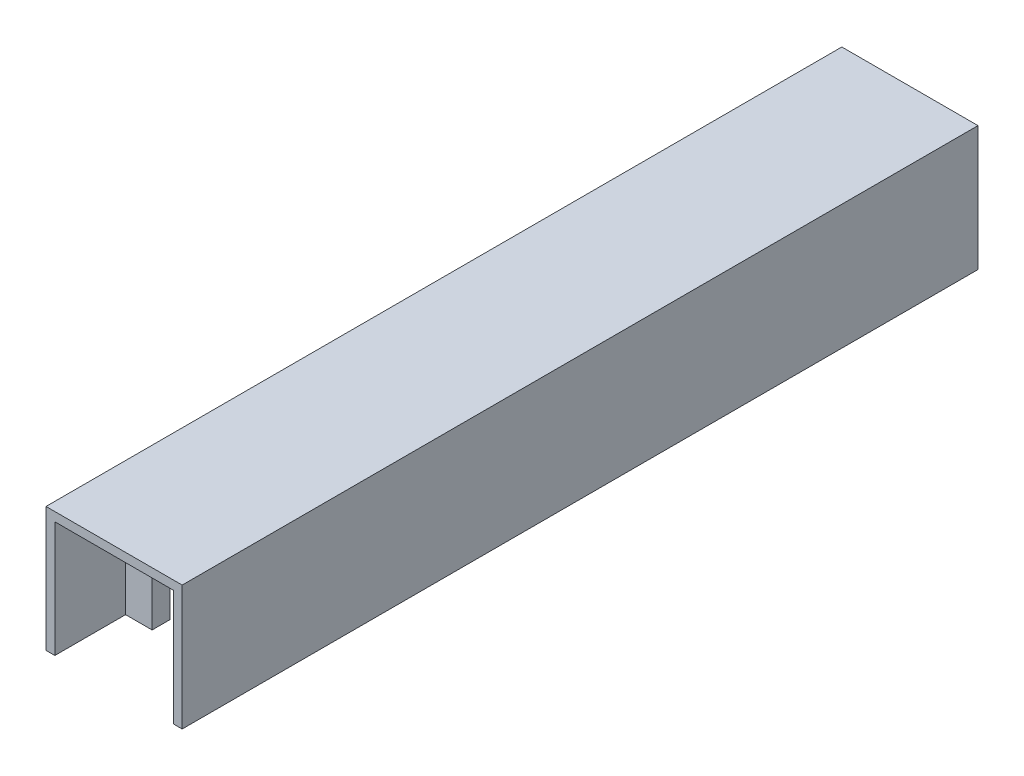
ISO-10303-21;
HEADER;
FILE_DESCRIPTION(('STEP AP214'),'2;1');
FILE_NAME('part.step','',(''),(''),'','','');
FILE_SCHEMA(('AUTOMOTIVE_DESIGN { 1 0 10303 214 1 1 1 1 }'));
ENDSEC;
DATA;
#1=APPLICATION_CONTEXT('core data for automotive mechanical design processes');
#2=APPLICATION_PROTOCOL_DEFINITION('international standard','automotive_design',2000,#1);
#3=PRODUCT_CONTEXT('',#1,'mechanical');
#4=PRODUCT('Part','Part','',(#3));
#5=PRODUCT_RELATED_PRODUCT_CATEGORY('part','',(#4));
#6=PRODUCT_DEFINITION_FORMATION('','',#4);
#7=PRODUCT_DEFINITION_CONTEXT('part definition',#1,'design');
#8=PRODUCT_DEFINITION('design','',#6,#7);
#9=PRODUCT_DEFINITION_SHAPE('','',#8);
#10=(LENGTH_UNIT() NAMED_UNIT(*) SI_UNIT(.MILLI.,.METRE.));
#11=(NAMED_UNIT(*) PLANE_ANGLE_UNIT() SI_UNIT($,.RADIAN.));
#12=(NAMED_UNIT(*) SI_UNIT($,.STERADIAN.) SOLID_ANGLE_UNIT());
#13=UNCERTAINTY_MEASURE_WITH_UNIT(LENGTH_MEASURE(1.E-05),#10,'distance_accuracy_value','');
#14=(GEOMETRIC_REPRESENTATION_CONTEXT(3) GLOBAL_UNCERTAINTY_ASSIGNED_CONTEXT((#13)) GLOBAL_UNIT_ASSIGNED_CONTEXT((#10,
#11,#12)) REPRESENTATION_CONTEXT('',''));
#15=CARTESIAN_POINT('',(0.,0.,0.));
#16=DIRECTION('',(0.,0.,1.));
#17=DIRECTION('',(1.,0.,0.));
#18=AXIS2_PLACEMENT_3D('',#15,#16,#17);
#19=CARTESIAN_POINT('',(-38.5,-35.,0.));
#20=DIRECTION('',(0.,-1.,0.));
#21=DIRECTION('',(0.,0.,-1.));
#22=AXIS2_PLACEMENT_3D('',#19,#20,#21);
#23=PLANE('',#22);
#24=DIRECTION('',(1.,0.,0.));
#25=VECTOR('',#24,1.);
#26=CARTESIAN_POINT('',(-26.,-35.,-50.));
#27=LINE('',#26,#25);
#28=CARTESIAN_POINT('',(-33.5,-35.,-50.));
#29=VERTEX_POINT('',#28);
#30=CARTESIAN_POINT('',(-18.5,-35.,-50.));
#31=VERTEX_POINT('',#30);
#32=EDGE_CURVE('E506',#29,#31,#27,.T.);
#33=ORIENTED_EDGE('',*,*,#32,.F.);
#34=DIRECTION('',(0.,0.,1.));
#35=VECTOR('',#34,1.);
#36=CARTESIAN_POINT('',(-33.5,-35.,25.));
#37=LINE('',#36,#35);
#38=CARTESIAN_POINT('',(-33.5,-35.,100.));
#39=VERTEX_POINT('',#38);
#40=EDGE_CURVE('E417',#29,#39,#37,.T.);
#41=ORIENTED_EDGE('',*,*,#40,.T.);
#42=DIRECTION('',(1.,0.,0.));
#43=VECTOR('',#42,1.);
#44=CARTESIAN_POINT('',(-26.,-35.,100.));
#45=LINE('',#44,#43);
#46=CARTESIAN_POINT('',(-18.5,-35.,100.));
#47=VERTEX_POINT('',#46);
#48=EDGE_CURVE('E490',#39,#47,#45,.T.);
#49=ORIENTED_EDGE('',*,*,#48,.T.);
#50=CARTESIAN_POINT('',(-18.5,-35.,110.));
#51=CARTESIAN_POINT('',(-18.5,-35.,100.));
#52=(BOUNDED_CURVE() B_SPLINE_CURVE(1,(#50,#51),.UNSPECIFIED.,.F.,
.F.) B_SPLINE_CURVE_WITH_KNOTS((2,2),(0.,10.),
.UNSPECIFIED.) CURVE() GEOMETRIC_REPRESENTATION_ITEM() RATIONAL_B_SPLINE_CURVE((1.,1.)) REPRESENTATION_ITEM(''));
#53=CARTESIAN_POINT('',(-18.5,-35.,110.));
#54=VERTEX_POINT('',#53);
#55=EDGE_CURVE('E371',#54,#47,#52,.T.);
#56=ORIENTED_EDGE('',*,*,#55,.F.);
#57=DIRECTION('',(1.,0.,0.));
#58=VECTOR('',#57,1.);
#59=CARTESIAN_POINT('',(-26.,-35.,110.));
#60=LINE('',#59,#58);
#61=CARTESIAN_POINT('',(-33.5,-35.,110.));
#62=VERTEX_POINT('',#61);
#63=EDGE_CURVE('E491',#62,#54,#60,.T.);
#64=ORIENTED_EDGE('',*,*,#63,.F.);
#65=DIRECTION('',(0.,0.,1.));
#66=VECTOR('',#65,1.);
#67=CARTESIAN_POINT('',(-33.5,-35.,130.));
#68=LINE('',#67,#66);
#69=CARTESIAN_POINT('',(-33.5,-35.,150.));
#70=VERTEX_POINT('',#69);
#71=EDGE_CURVE('E44',#62,#70,#68,.T.);
#72=ORIENTED_EDGE('',*,*,#71,.T.);
#73=DIRECTION('',(-1.,0.,0.));
#74=VECTOR('',#73,1.);
#75=CARTESIAN_POINT('',(-36.,-35.,150.));
#76=LINE('',#75,#74);
#77=CARTESIAN_POINT('',(-38.5,-35.,150.));
#78=VERTEX_POINT('',#77);
#79=EDGE_CURVE('E466',#70,#78,#76,.T.);
#80=ORIENTED_EDGE('',*,*,#79,.T.);
#81=DIRECTION('',(0.,0.,1.));
#82=VECTOR('',#81,1.);
#83=CARTESIAN_POINT('',(-38.5,-35.,-75.));
#84=LINE('',#83,#82);
#85=CARTESIAN_POINT('',(-38.5,-35.,-300.));
#86=VERTEX_POINT('',#85);
#87=EDGE_CURVE('E11',#86,#78,#84,.T.);
#88=ORIENTED_EDGE('',*,*,#87,.F.);
#89=DIRECTION('',(-1.,0.,0.));
#90=VECTOR('',#89,1.);
#91=CARTESIAN_POINT('',(-36.,-35.,-300.));
#92=LINE('',#91,#90);
#93=CARTESIAN_POINT('',(-33.5,-35.,-300.));
#94=VERTEX_POINT('',#93);
#95=EDGE_CURVE('E361',#94,#86,#92,.T.);
#96=ORIENTED_EDGE('',*,*,#95,.F.);
#97=DIRECTION('',(0.,0.,1.));
#98=VECTOR('',#97,1.);
#99=CARTESIAN_POINT('',(-33.5,-35.,-260.));
#100=LINE('',#99,#98);
#101=CARTESIAN_POINT('',(-33.5,-35.,-220.));
#102=VERTEX_POINT('',#101);
#103=EDGE_CURVE('E252',#94,#102,#100,.T.);
#104=ORIENTED_EDGE('',*,*,#103,.T.);
#105=DIRECTION('',(1.,0.,0.));
#106=VECTOR('',#105,1.);
#107=CARTESIAN_POINT('',(-26.,-35.,-220.));
#108=LINE('',#107,#106);
#109=CARTESIAN_POINT('',(-18.5,-35.,-220.));
#110=VERTEX_POINT('',#109);
#111=EDGE_CURVE('E373',#102,#110,#108,.T.);
#112=ORIENTED_EDGE('',*,*,#111,.T.);
#113=CARTESIAN_POINT('',(-18.5,-35.,-210.));
#114=CARTESIAN_POINT('',(-18.5,-35.,-220.));
#115=(BOUNDED_CURVE() B_SPLINE_CURVE(1,(#113,#114),.UNSPECIFIED.,.F.,
.F.) B_SPLINE_CURVE_WITH_KNOTS((2,2),(0.,10.),
.UNSPECIFIED.) CURVE() GEOMETRIC_REPRESENTATION_ITEM() RATIONAL_B_SPLINE_CURVE((1.,1.)) REPRESENTATION_ITEM(''));
#116=CARTESIAN_POINT('',(-18.5,-35.,-210.));
#117=VERTEX_POINT('',#116);
#118=EDGE_CURVE('E238',#117,#110,#115,.T.);
#119=ORIENTED_EDGE('',*,*,#118,.F.);
#120=DIRECTION('',(1.,0.,0.));
#121=VECTOR('',#120,1.);
#122=CARTESIAN_POINT('',(-26.,-35.,-210.));
#123=LINE('',#122,#121);
#124=CARTESIAN_POINT('',(-33.5,-35.,-210.));
#125=VERTEX_POINT('',#124);
#126=EDGE_CURVE('E518',#125,#117,#123,.T.);
#127=ORIENTED_EDGE('',*,*,#126,.F.);
#128=DIRECTION('',(0.,0.,1.));
#129=VECTOR('',#128,1.);
#130=CARTESIAN_POINT('',(-33.5,-35.,-135.));
#131=LINE('',#130,#129);
#132=CARTESIAN_POINT('',(-33.5,-35.,-60.));
#133=VERTEX_POINT('',#132);
#134=EDGE_CURVE('E420',#125,#133,#131,.T.);
#135=ORIENTED_EDGE('',*,*,#134,.T.);
#136=DIRECTION('',(1.,0.,0.));
#137=VECTOR('',#136,1.);
#138=CARTESIAN_POINT('',(-26.,-35.,-60.));
#139=LINE('',#138,#137);
#140=CARTESIAN_POINT('',(-18.5,-35.,-60.));
#141=VERTEX_POINT('',#140);
#142=EDGE_CURVE('E505',#133,#141,#139,.T.);
#143=ORIENTED_EDGE('',*,*,#142,.T.);
#144=CARTESIAN_POINT('',(-18.5,-35.,-50.));
#145=CARTESIAN_POINT('',(-18.5,-35.,-60.));
#146=(BOUNDED_CURVE() B_SPLINE_CURVE(1,(#144,#145),.UNSPECIFIED.,.F.,
.F.) B_SPLINE_CURVE_WITH_KNOTS((2,2),(0.,10.),
.UNSPECIFIED.) CURVE() GEOMETRIC_REPRESENTATION_ITEM() RATIONAL_B_SPLINE_CURVE((1.,1.)) REPRESENTATION_ITEM(''));
#147=EDGE_CURVE('E377',#31,#141,#146,.T.);
#148=ORIENTED_EDGE('',*,*,#147,.F.);
#149=EDGE_LOOP('',(#33,#41,#49,#56,#64,#72,#80,#88,#96,#104,#112,#119,#127,#135,#143,#148));
#150=FACE_BOUND('',#149,.T.);
#151=ADVANCED_FACE('F17',(#150),#23,.T.);
#152=CARTESIAN_POINT('',(-38.5,-35.,0.));
#153=DIRECTION('',(1.,0.,0.));
#154=DIRECTION('',(0.,1.,0.));
#155=AXIS2_PLACEMENT_3D('',#152,#153,#154);
#156=PLANE('',#155);
#157=DIRECTION('',(0.,1.,0.));
#158=VECTOR('',#157,1.);
#159=CARTESIAN_POINT('',(-38.5,0.25,150.));
#160=LINE('',#159,#158);
#161=CARTESIAN_POINT('',(-38.5,35.5,150.));
#162=VERTEX_POINT('',#161);
#163=EDGE_CURVE('E463',#78,#162,#160,.T.);
#164=ORIENTED_EDGE('',*,*,#163,.T.);
#165=DIRECTION('',(0.,0.,1.));
#166=VECTOR('',#165,1.);
#167=CARTESIAN_POINT('',(-38.5,35.5,-75.));
#168=LINE('',#167,#166);
#169=CARTESIAN_POINT('',(-38.5,35.5,-300.));
#170=VERTEX_POINT('',#169);
#171=EDGE_CURVE('E30',#170,#162,#168,.T.);
#172=ORIENTED_EDGE('',*,*,#171,.F.);
#173=DIRECTION('',(0.,1.,0.));
#174=VECTOR('',#173,1.);
#175=CARTESIAN_POINT('',(-38.5,0.25,-300.));
#176=LINE('',#175,#174);
#177=EDGE_CURVE('E365',#86,#170,#176,.T.);
#178=ORIENTED_EDGE('',*,*,#177,.F.);
#179=ORIENTED_EDGE('',*,*,#87,.T.);
#180=EDGE_LOOP('',(#164,#172,#178,#179));
#181=FACE_BOUND('',#180,.T.);
#182=ADVANCED_FACE('F748',(#181),#156,.F.);
#183=CARTESIAN_POINT('',(-38.5,35.5,0.));
#184=DIRECTION('',(0.,-1.,0.));
#185=DIRECTION('',(0.,0.,-1.));
#186=AXIS2_PLACEMENT_3D('',#183,#184,#185);
#187=PLANE('',#186);
#188=DIRECTION('',(1.,0.,0.));
#189=VECTOR('',#188,1.);
#190=CARTESIAN_POINT('',(0.,35.5,150.));
#191=LINE('',#190,#189);
#192=CARTESIAN_POINT('',(38.5,35.5,150.));
#193=VERTEX_POINT('',#192);
#194=EDGE_CURVE('E467',#162,#193,#191,.T.);
#195=ORIENTED_EDGE('',*,*,#194,.T.);
#196=DIRECTION('',(0.,0.,1.));
#197=VECTOR('',#196,1.);
#198=CARTESIAN_POINT('',(38.5,35.5,-75.));
#199=LINE('',#198,#197);
#200=CARTESIAN_POINT('',(38.5,35.5,-300.));
#201=VERTEX_POINT('',#200);
#202=EDGE_CURVE('E484',#201,#193,#199,.T.);
#203=ORIENTED_EDGE('',*,*,#202,.F.);
#204=DIRECTION('',(1.,0.,0.));
#205=VECTOR('',#204,1.);
#206=CARTESIAN_POINT('',(0.,35.5,-300.));
#207=LINE('',#206,#205);
#208=EDGE_CURVE('E546',#170,#201,#207,.T.);
#209=ORIENTED_EDGE('',*,*,#208,.F.);
#210=ORIENTED_EDGE('',*,*,#171,.T.);
#211=EDGE_LOOP('',(#195,#203,#209,#210));
#212=FACE_BOUND('',#211,.T.);
#213=ADVANCED_FACE('F712',(#212),#187,.F.);
#214=CARTESIAN_POINT('',(38.5,-35.,0.));
#215=DIRECTION('',(1.,0.,0.));
#216=DIRECTION('',(0.,1.,0.));
#217=AXIS2_PLACEMENT_3D('',#214,#215,#216);
#218=PLANE('',#217);
#219=DIRECTION('',(0.,-1.,0.));
#220=VECTOR('',#219,1.);
#221=CARTESIAN_POINT('',(38.5,0.25,150.));
#222=LINE('',#221,#220);
#223=CARTESIAN_POINT('',(38.5,-35.,150.));
#224=VERTEX_POINT('',#223);
#225=EDGE_CURVE('E400',#193,#224,#222,.T.);
#226=ORIENTED_EDGE('',*,*,#225,.T.);
#227=DIRECTION('',(0.,0.,1.));
#228=VECTOR('',#227,1.);
#229=CARTESIAN_POINT('',(38.5,-35.,-75.));
#230=LINE('',#229,#228);
#231=CARTESIAN_POINT('',(38.5,-35.,-300.));
#232=VERTEX_POINT('',#231);
#233=EDGE_CURVE('E354',#232,#224,#230,.T.);
#234=ORIENTED_EDGE('',*,*,#233,.F.);
#235=DIRECTION('',(0.,-1.,0.));
#236=VECTOR('',#235,1.);
#237=CARTESIAN_POINT('',(38.5,0.25,-300.));
#238=LINE('',#237,#236);
#239=EDGE_CURVE('E543',#201,#232,#238,.T.);
#240=ORIENTED_EDGE('',*,*,#239,.F.);
#241=ORIENTED_EDGE('',*,*,#202,.T.);
#242=EDGE_LOOP('',(#226,#234,#240,#241));
#243=FACE_BOUND('',#242,.T.);
#244=ADVANCED_FACE('F706',(#243),#218,.T.);
#245=CARTESIAN_POINT('',(-33.5,30.5,0.));
#246=DIRECTION('',(-1.,0.,0.));
#247=DIRECTION('',(0.,0.,1.));
#248=AXIS2_PLACEMENT_3D('',#245,#246,#247);
#249=PLANE('',#248);
#250=DIRECTION('',(0.,-1.,0.));
#251=VECTOR('',#250,1.);
#252=CARTESIAN_POINT('',(-33.5,-2.25,110.));
#253=LINE('',#252,#251);
#254=CARTESIAN_POINT('',(-33.5,30.5,110.));
#255=VERTEX_POINT('',#254);
#256=EDGE_CURVE('E535',#255,#62,#253,.T.);
#257=ORIENTED_EDGE('',*,*,#256,.F.);
#258=DIRECTION('',(0.,0.,1.));
#259=VECTOR('',#258,1.);
#260=CARTESIAN_POINT('',(-33.5,30.5,130.));
#261=LINE('',#260,#259);
#262=CARTESIAN_POINT('',(-33.5,30.5,150.));
#263=VERTEX_POINT('',#262);
#264=EDGE_CURVE('E406',#255,#263,#261,.T.);
#265=ORIENTED_EDGE('',*,*,#264,.T.);
#266=DIRECTION('',(0.,-1.,0.));
#267=VECTOR('',#266,1.);
#268=CARTESIAN_POINT('',(-33.5,-2.25,150.));
#269=LINE('',#268,#267);
#270=EDGE_CURVE('E485',#263,#70,#269,.T.);
#271=ORIENTED_EDGE('',*,*,#270,.T.);
#272=ORIENTED_EDGE('',*,*,#71,.F.);
#273=EDGE_LOOP('',(#257,#265,#271,#272));
#274=FACE_BOUND('',#273,.T.);
#275=ADVANCED_FACE('F711',(#274),#249,.F.);
#276=CARTESIAN_POINT('',(0.,0.,150.));
#277=DIRECTION('',(0.,0.,1.));
#278=DIRECTION('',(1.,0.,0.));
#279=AXIS2_PLACEMENT_3D('',#276,#277,#278);
#280=PLANE('',#279);
#281=DIRECTION('',(-1.,0.,0.));
#282=VECTOR('',#281,1.);
#283=CARTESIAN_POINT('',(0.,30.5,150.));
#284=LINE('',#283,#282);
#285=CARTESIAN_POINT('',(33.5,30.5,150.));
#286=VERTEX_POINT('',#285);
#287=EDGE_CURVE('E413',#286,#263,#284,.T.);
#288=ORIENTED_EDGE('',*,*,#287,.F.);
#289=DIRECTION('',(0.,1.,0.));
#290=VECTOR('',#289,1.);
#291=CARTESIAN_POINT('',(33.5,-2.25,150.));
#292=LINE('',#291,#290);
#293=CARTESIAN_POINT('',(33.5,-35.,150.));
#294=VERTEX_POINT('',#293);
#295=EDGE_CURVE('E397',#294,#286,#292,.T.);
#296=ORIENTED_EDGE('',*,*,#295,.F.);
#297=DIRECTION('',(-1.,0.,0.));
#298=VECTOR('',#297,1.);
#299=CARTESIAN_POINT('',(36.,-35.,150.));
#300=LINE('',#299,#298);
#301=EDGE_CURVE('E426',#224,#294,#300,.T.);
#302=ORIENTED_EDGE('',*,*,#301,.F.);
#303=ORIENTED_EDGE('',*,*,#225,.F.);
#304=ORIENTED_EDGE('',*,*,#194,.F.);
#305=ORIENTED_EDGE('',*,*,#163,.F.);
#306=ORIENTED_EDGE('',*,*,#79,.F.);
#307=ORIENTED_EDGE('',*,*,#270,.F.);
#308=EDGE_LOOP('',(#288,#296,#302,#303,#304,#305,#306,#307));
#309=FACE_BOUND('',#308,.T.);
#310=ADVANCED_FACE('F924',(#309),#280,.T.);
#311=CARTESIAN_POINT('',(33.5,-35.,0.));
#312=DIRECTION('',(1.,0.,0.));
#313=DIRECTION('',(0.,1.,0.));
#314=AXIS2_PLACEMENT_3D('',#311,#312,#313);
#315=PLANE('',#314);
#316=DIRECTION('',(0.,1.,0.));
#317=VECTOR('',#316,1.);
#318=CARTESIAN_POINT('',(33.5,-2.25,110.));
#319=LINE('',#318,#317);
#320=CARTESIAN_POINT('',(33.5,-35.,110.));
#321=VERTEX_POINT('',#320);
#322=CARTESIAN_POINT('',(33.5,30.5,110.));
#323=VERTEX_POINT('',#322);
#324=EDGE_CURVE('E401',#321,#323,#319,.T.);
#325=ORIENTED_EDGE('',*,*,#324,.F.);
#326=DIRECTION('',(0.,0.,1.));
#327=VECTOR('',#326,1.);
#328=CARTESIAN_POINT('',(33.5,-35.,130.));
#329=LINE('',#328,#327);
#330=EDGE_CURVE('E421',#321,#294,#329,.T.);
#331=ORIENTED_EDGE('',*,*,#330,.T.);
#332=ORIENTED_EDGE('',*,*,#295,.T.);
#333=DIRECTION('',(0.,0.,1.));
#334=VECTOR('',#333,1.);
#335=CARTESIAN_POINT('',(33.5,30.5,130.));
#336=LINE('',#335,#334);
#337=EDGE_CURVE('E451',#323,#286,#336,.T.);
#338=ORIENTED_EDGE('',*,*,#337,.F.);
#339=EDGE_LOOP('',(#325,#331,#332,#338));
#340=FACE_BOUND('',#339,.T.);
#341=ADVANCED_FACE('F799',(#340),#315,.F.);
#342=CARTESIAN_POINT('',(33.5,-35.,110.));
#343=DIRECTION('',(0.,0.,1.));
#344=DIRECTION('',(1.,0.,0.));
#345=AXIS2_PLACEMENT_3D('',#342,#343,#344);
#346=PLANE('',#345);
#347=DIRECTION('',(-1.,0.,0.));
#348=VECTOR('',#347,1.);
#349=CARTESIAN_POINT('',(26.,-35.,110.));
#350=LINE('',#349,#348);
#351=CARTESIAN_POINT('',(18.5,-35.,110.));
#352=VERTEX_POINT('',#351);
#353=EDGE_CURVE('E425',#321,#352,#350,.T.);
#354=ORIENTED_EDGE('',*,*,#353,.F.);
#355=ORIENTED_EDGE('',*,*,#324,.T.);
#356=DIRECTION('',(-1.,0.,0.));
#357=VECTOR('',#356,1.);
#358=CARTESIAN_POINT('',(26.,30.5,110.));
#359=LINE('',#358,#357);
#360=CARTESIAN_POINT('',(18.5,30.5,110.));
#361=VERTEX_POINT('',#360);
#362=EDGE_CURVE('E556',#323,#361,#359,.T.);
#363=ORIENTED_EDGE('',*,*,#362,.T.);
#364=DIRECTION('',(0.,1.,0.));
#365=VECTOR('',#364,1.);
#366=CARTESIAN_POINT('',(18.5,-2.25,110.));
#367=LINE('',#366,#365);
#368=EDGE_CURVE('E395',#352,#361,#367,.T.);
#369=ORIENTED_EDGE('',*,*,#368,.F.);
#370=EDGE_LOOP('',(#354,#355,#363,#369));
#371=FACE_BOUND('',#370,.T.);
#372=ADVANCED_FACE('F793',(#371),#346,.T.);
#373=CARTESIAN_POINT('',(18.5,0.,0.));
#374=DIRECTION('',(-1.,0.,0.));
#375=DIRECTION('',(0.,0.,1.));
#376=AXIS2_PLACEMENT_3D('',#373,#374,#375);
#377=PLANE('',#376);
#378=DIRECTION('',(0.,0.,1.));
#379=VECTOR('',#378,1.);
#380=CARTESIAN_POINT('',(18.5,-35.,105.));
#381=LINE('',#380,#379);
#382=CARTESIAN_POINT('',(18.5,-35.,100.));
#383=VERTEX_POINT('',#382);
#384=EDGE_CURVE('E457',#383,#352,#381,.T.);
#385=ORIENTED_EDGE('',*,*,#384,.T.);
#386=ORIENTED_EDGE('',*,*,#368,.T.);
#387=DIRECTION('',(0.,0.,-1.));
#388=VECTOR('',#387,1.);
#389=CARTESIAN_POINT('',(18.5,30.5,105.));
#390=LINE('',#389,#388);
#391=CARTESIAN_POINT('',(18.5,30.5,100.));
#392=VERTEX_POINT('',#391);
#393=EDGE_CURVE('E552',#361,#392,#390,.T.);
#394=ORIENTED_EDGE('',*,*,#393,.T.);
#395=DIRECTION('',(0.,-1.,0.));
#396=VECTOR('',#395,1.);
#397=CARTESIAN_POINT('',(18.5,-2.25,100.));
#398=LINE('',#397,#396);
#399=EDGE_CURVE('E392',#392,#383,#398,.T.);
#400=ORIENTED_EDGE('',*,*,#399,.T.);
#401=EDGE_LOOP('',(#385,#386,#394,#400));
#402=FACE_BOUND('',#401,.T.);
#403=ADVANCED_FACE('F798',(#402),#377,.T.);
#404=CARTESIAN_POINT('',(33.5,-35.,100.));
#405=DIRECTION('',(0.,0.,1.));
#406=DIRECTION('',(1.,0.,0.));
#407=AXIS2_PLACEMENT_3D('',#404,#405,#406);
#408=PLANE('',#407);
#409=DIRECTION('',(-1.,0.,0.));
#410=VECTOR('',#409,1.);
#411=CARTESIAN_POINT('',(26.,30.5,100.));
#412=LINE('',#411,#410);
#413=CARTESIAN_POINT('',(33.5,30.5,100.));
#414=VERTEX_POINT('',#413);
#415=EDGE_CURVE('E415',#414,#392,#412,.T.);
#416=ORIENTED_EDGE('',*,*,#415,.F.);
#417=DIRECTION('',(0.,-1.,0.));
#418=VECTOR('',#417,1.);
#419=CARTESIAN_POINT('',(33.5,-2.25,100.));
#420=LINE('',#419,#418);
#421=CARTESIAN_POINT('',(33.5,-35.,100.));
#422=VERTEX_POINT('',#421);
#423=EDGE_CURVE('E396',#414,#422,#420,.T.);
#424=ORIENTED_EDGE('',*,*,#423,.T.);
#425=DIRECTION('',(-1.,0.,0.));
#426=VECTOR('',#425,1.);
#427=CARTESIAN_POINT('',(26.,-35.,100.));
#428=LINE('',#427,#426);
#429=EDGE_CURVE('E452',#422,#383,#428,.T.);
#430=ORIENTED_EDGE('',*,*,#429,.T.);
#431=ORIENTED_EDGE('',*,*,#399,.F.);
#432=EDGE_LOOP('',(#416,#424,#430,#431));
#433=FACE_BOUND('',#432,.T.);
#434=ADVANCED_FACE('F816',(#433),#408,.F.);
#435=CARTESIAN_POINT('',(33.5,-35.,0.));
#436=DIRECTION('',(1.,0.,0.));
#437=DIRECTION('',(0.,1.,0.));
#438=AXIS2_PLACEMENT_3D('',#435,#436,#437);
#439=PLANE('',#438);
#440=ORIENTED_EDGE('',*,*,#423,.F.);
#441=DIRECTION('',(0.,0.,1.));
#442=VECTOR('',#441,1.);
#443=CARTESIAN_POINT('',(33.5,30.5,25.));
#444=LINE('',#443,#442);
#445=CARTESIAN_POINT('',(33.5,30.5,-50.));
#446=VERTEX_POINT('',#445);
#447=EDGE_CURVE('E338',#446,#414,#444,.T.);
#448=ORIENTED_EDGE('',*,*,#447,.F.);
#449=DIRECTION('',(0.,1.,0.));
#450=VECTOR('',#449,1.);
#451=CARTESIAN_POINT('',(33.5,-2.25,-50.));
#452=LINE('',#451,#450);
#453=CARTESIAN_POINT('',(33.5,-35.,-50.));
#454=VERTEX_POINT('',#453);
#455=EDGE_CURVE('E329',#454,#446,#452,.T.);
#456=ORIENTED_EDGE('',*,*,#455,.F.);
#457=DIRECTION('',(0.,0.,1.));
#458=VECTOR('',#457,1.);
#459=CARTESIAN_POINT('',(33.5,-35.,25.));
#460=LINE('',#459,#458);
#461=EDGE_CURVE('E456',#454,#422,#460,.T.);
#462=ORIENTED_EDGE('',*,*,#461,.T.);
#463=EDGE_LOOP('',(#440,#448,#456,#462));
#464=FACE_BOUND('',#463,.T.);
#465=ADVANCED_FACE('F821',(#464),#439,.F.);
#466=CARTESIAN_POINT('',(33.5,30.5,-50.));
#467=DIRECTION('',(0.,0.,-1.));
#468=DIRECTION('',(0.,-1.,0.));
#469=AXIS2_PLACEMENT_3D('',#466,#467,#468);
#470=PLANE('',#469);
#471=DIRECTION('',(-1.,0.,0.));
#472=VECTOR('',#471,1.);
#473=CARTESIAN_POINT('',(26.,-35.,-50.));
#474=LINE('',#473,#472);
#475=CARTESIAN_POINT('',(18.5,-35.,-50.));
#476=VERTEX_POINT('',#475);
#477=EDGE_CURVE('E409',#454,#476,#474,.T.);
#478=ORIENTED_EDGE('',*,*,#477,.F.);
#479=ORIENTED_EDGE('',*,*,#455,.T.);
#480=DIRECTION('',(-1.,0.,0.));
#481=VECTOR('',#480,1.);
#482=CARTESIAN_POINT('',(26.,30.5,-50.));
#483=LINE('',#482,#481);
#484=CARTESIAN_POINT('',(18.5,30.5,-50.));
#485=VERTEX_POINT('',#484);
#486=EDGE_CURVE('E333',#446,#485,#483,.T.);
#487=ORIENTED_EDGE('',*,*,#486,.T.);
#488=DIRECTION('',(0.,1.,0.));
#489=VECTOR('',#488,1.);
#490=CARTESIAN_POINT('',(18.5,-2.25,-50.));
#491=LINE('',#490,#489);
#492=EDGE_CURVE('E317',#476,#485,#491,.T.);
#493=ORIENTED_EDGE('',*,*,#492,.F.);
#494=EDGE_LOOP('',(#478,#479,#487,#493));
#495=FACE_BOUND('',#494,.T.);
#496=ADVANCED_FACE('F334',(#495),#470,.F.);
#497=CARTESIAN_POINT('',(18.5,0.,0.));
#498=DIRECTION('',(-1.,0.,0.));
#499=DIRECTION('',(0.,0.,1.));
#500=AXIS2_PLACEMENT_3D('',#497,#498,#499);
#501=PLANE('',#500);
#502=DIRECTION('',(0.,0.,1.));
#503=VECTOR('',#502,1.);
#504=CARTESIAN_POINT('',(18.5,-35.,-55.));
#505=LINE('',#504,#503);
#506=CARTESIAN_POINT('',(18.5,-35.,-60.));
#507=VERTEX_POINT('',#506);
#508=EDGE_CURVE('E324',#507,#476,#505,.T.);
#509=ORIENTED_EDGE('',*,*,#508,.T.);
#510=ORIENTED_EDGE('',*,*,#492,.T.);
#511=DIRECTION('',(0.,0.,-1.));
#512=VECTOR('',#511,1.);
#513=CARTESIAN_POINT('',(18.5,30.5,-55.));
#514=LINE('',#513,#512);
#515=CARTESIAN_POINT('',(18.5,30.5,-60.));
#516=VERTEX_POINT('',#515);
#517=EDGE_CURVE('E321',#485,#516,#514,.T.);
#518=ORIENTED_EDGE('',*,*,#517,.T.);
#519=DIRECTION('',(0.,-1.,0.));
#520=VECTOR('',#519,1.);
#521=CARTESIAN_POINT('',(18.5,-2.25,-60.));
#522=LINE('',#521,#520);
#523=EDGE_CURVE('E330',#516,#507,#522,.T.);
#524=ORIENTED_EDGE('',*,*,#523,.T.);
#525=EDGE_LOOP('',(#509,#510,#518,#524));
#526=FACE_BOUND('',#525,.T.);
#527=ADVANCED_FACE('F319',(#526),#501,.T.);
#528=CARTESIAN_POINT('',(33.5,-35.,-60.));
#529=DIRECTION('',(0.,0.,1.));
#530=DIRECTION('',(1.,0.,0.));
#531=AXIS2_PLACEMENT_3D('',#528,#529,#530);
#532=PLANE('',#531);
#533=DIRECTION('',(-1.,0.,0.));
#534=VECTOR('',#533,1.);
#535=CARTESIAN_POINT('',(26.,30.5,-60.));
#536=LINE('',#535,#534);
#537=CARTESIAN_POINT('',(33.5,30.5,-60.));
#538=VERTEX_POINT('',#537);
#539=EDGE_CURVE('E343',#538,#516,#536,.T.);
#540=ORIENTED_EDGE('',*,*,#539,.F.);
#541=DIRECTION('',(0.,-1.,0.));
#542=VECTOR('',#541,1.);
#543=CARTESIAN_POINT('',(33.5,-2.25,-60.));
#544=LINE('',#543,#542);
#545=CARTESIAN_POINT('',(33.5,-35.,-60.));
#546=VERTEX_POINT('',#545);
#547=EDGE_CURVE('E356',#538,#546,#544,.T.);
#548=ORIENTED_EDGE('',*,*,#547,.T.);
#549=DIRECTION('',(-1.,0.,0.));
#550=VECTOR('',#549,1.);
#551=CARTESIAN_POINT('',(26.,-35.,-60.));
#552=LINE('',#551,#550);
#553=EDGE_CURVE('E469',#546,#507,#552,.T.);
#554=ORIENTED_EDGE('',*,*,#553,.T.);
#555=ORIENTED_EDGE('',*,*,#523,.F.);
#556=EDGE_LOOP('',(#540,#548,#554,#555));
#557=FACE_BOUND('',#556,.T.);
#558=ADVANCED_FACE('F736',(#557),#532,.F.);
#559=CARTESIAN_POINT('',(33.5,-35.,0.));
#560=DIRECTION('',(1.,0.,0.));
#561=DIRECTION('',(0.,1.,0.));
#562=AXIS2_PLACEMENT_3D('',#559,#560,#561);
#563=PLANE('',#562);
#564=DIRECTION('',(0.,0.,1.));
#565=VECTOR('',#564,1.);
#566=CARTESIAN_POINT('',(33.5,30.5,-135.));
#567=LINE('',#566,#565);
#568=CARTESIAN_POINT('',(33.5,30.5,-210.));
#569=VERTEX_POINT('',#568);
#570=EDGE_CURVE('E350',#569,#538,#567,.T.);
#571=ORIENTED_EDGE('',*,*,#570,.F.);
#572=DIRECTION('',(0.,1.,0.));
#573=VECTOR('',#572,1.);
#574=CARTESIAN_POINT('',(33.5,-2.25,-210.));
#575=LINE('',#574,#573);
#576=CARTESIAN_POINT('',(33.5,-35.,-210.));
#577=VERTEX_POINT('',#576);
#578=EDGE_CURVE('E167',#577,#569,#575,.T.);
#579=ORIENTED_EDGE('',*,*,#578,.F.);
#580=DIRECTION('',(0.,0.,1.));
#581=VECTOR('',#580,1.);
#582=CARTESIAN_POINT('',(33.5,-35.,-135.));
#583=LINE('',#582,#581);
#584=EDGE_CURVE('E473',#577,#546,#583,.T.);
#585=ORIENTED_EDGE('',*,*,#584,.T.);
#586=ORIENTED_EDGE('',*,*,#547,.F.);
#587=EDGE_LOOP('',(#571,#579,#585,#586));
#588=FACE_BOUND('',#587,.T.);
#589=ADVANCED_FACE('F698',(#588),#563,.F.);
#590=CARTESIAN_POINT('',(33.5,30.5,-210.));
#591=DIRECTION('',(0.,0.,-1.));
#592=DIRECTION('',(0.,-1.,0.));
#593=AXIS2_PLACEMENT_3D('',#590,#591,#592);
#594=PLANE('',#593);
#595=DIRECTION('',(-1.,0.,0.));
#596=VECTOR('',#595,1.);
#597=CARTESIAN_POINT('',(26.,-35.,-210.));
#598=LINE('',#597,#596);
#599=CARTESIAN_POINT('',(18.5,-35.,-210.));
#600=VERTEX_POINT('',#599);
#601=EDGE_CURVE('E551',#577,#600,#598,.T.);
#602=ORIENTED_EDGE('',*,*,#601,.F.);
#603=ORIENTED_EDGE('',*,*,#578,.T.);
#604=DIRECTION('',(-1.,0.,0.));
#605=VECTOR('',#604,1.);
#606=CARTESIAN_POINT('',(26.,30.5,-210.));
#607=LINE('',#606,#605);
#608=CARTESIAN_POINT('',(18.5,30.5,-210.));
#609=VERTEX_POINT('',#608);
#610=EDGE_CURVE('E429',#569,#609,#607,.T.);
#611=ORIENTED_EDGE('',*,*,#610,.T.);
#612=DIRECTION('',(0.,1.,0.));
#613=VECTOR('',#612,1.);
#614=CARTESIAN_POINT('',(18.5,-2.25,-210.));
#615=LINE('',#614,#613);
#616=EDGE_CURVE('E151',#600,#609,#615,.T.);
#617=ORIENTED_EDGE('',*,*,#616,.F.);
#618=EDGE_LOOP('',(#602,#603,#611,#617));
#619=FACE_BOUND('',#618,.T.);
#620=ADVANCED_FACE('F692',(#619),#594,.F.);
#621=CARTESIAN_POINT('',(0.,0.,-300.));
#622=DIRECTION('',(0.,0.,1.));
#623=DIRECTION('',(1.,0.,0.));
#624=AXIS2_PLACEMENT_3D('',#621,#622,#623);
#625=PLANE('',#624);
#626=DIRECTION('',(0.,-1.,0.));
#627=VECTOR('',#626,1.);
#628=CARTESIAN_POINT('',(-33.5,-2.25,-300.));
#629=LINE('',#628,#627);
#630=CARTESIAN_POINT('',(-33.5,30.5,-300.));
#631=VERTEX_POINT('',#630);
#632=EDGE_CURVE('E366',#631,#94,#629,.T.);
#633=ORIENTED_EDGE('',*,*,#632,.T.);
#634=ORIENTED_EDGE('',*,*,#95,.T.);
#635=ORIENTED_EDGE('',*,*,#177,.T.);
#636=ORIENTED_EDGE('',*,*,#208,.T.);
#637=ORIENTED_EDGE('',*,*,#239,.T.);
#638=DIRECTION('',(-1.,0.,0.));
#639=VECTOR('',#638,1.);
#640=CARTESIAN_POINT('',(36.,-35.,-300.));
#641=LINE('',#640,#639);
#642=CARTESIAN_POINT('',(33.5,-35.,-300.));
#643=VERTEX_POINT('',#642);
#644=EDGE_CURVE('E550',#232,#643,#641,.T.);
#645=ORIENTED_EDGE('',*,*,#644,.T.);
#646=DIRECTION('',(0.,1.,0.));
#647=VECTOR('',#646,1.);
#648=CARTESIAN_POINT('',(33.5,-2.25,-300.));
#649=LINE('',#648,#647);
#650=CARTESIAN_POINT('',(33.5,30.5,-300.));
#651=VERTEX_POINT('',#650);
#652=EDGE_CURVE('E402',#643,#651,#649,.T.);
#653=ORIENTED_EDGE('',*,*,#652,.T.);
#654=DIRECTION('',(-1.,0.,0.));
#655=VECTOR('',#654,1.);
#656=CARTESIAN_POINT('',(0.,30.5,-300.));
#657=LINE('',#656,#655);
#658=EDGE_CURVE('E360',#651,#631,#657,.T.);
#659=ORIENTED_EDGE('',*,*,#658,.T.);
#660=EDGE_LOOP('',(#633,#634,#635,#636,#637,#645,#653,#659));
#661=FACE_BOUND('',#660,.T.);
#662=ADVANCED_FACE('F697',(#661),#625,.F.);
#663=CARTESIAN_POINT('',(-33.5,30.5,0.));
#664=DIRECTION('',(-1.,0.,0.));
#665=DIRECTION('',(0.,0.,1.));
#666=AXIS2_PLACEMENT_3D('',#663,#664,#665);
#667=PLANE('',#666);
#668=DIRECTION('',(0.,1.,0.));
#669=VECTOR('',#668,1.);
#670=CARTESIAN_POINT('',(-33.5,-2.25,-220.));
#671=LINE('',#670,#669);
#672=CARTESIAN_POINT('',(-33.5,30.5,-220.));
#673=VERTEX_POINT('',#672);
#674=EDGE_CURVE('E376',#102,#673,#671,.T.);
#675=ORIENTED_EDGE('',*,*,#674,.F.);
#676=ORIENTED_EDGE('',*,*,#103,.F.);
#677=ORIENTED_EDGE('',*,*,#632,.F.);
#678=DIRECTION('',(0.,0.,1.));
#679=VECTOR('',#678,1.);
#680=CARTESIAN_POINT('',(-33.5,30.5,-260.));
#681=LINE('',#680,#679);
#682=EDGE_CURVE('E390',#631,#673,#681,.T.);
#683=ORIENTED_EDGE('',*,*,#682,.T.);
#684=EDGE_LOOP('',(#675,#676,#677,#683));
#685=FACE_BOUND('',#684,.T.);
#686=ADVANCED_FACE('F937',(#685),#667,.F.);
#687=CARTESIAN_POINT('',(-33.5,30.5,0.));
#688=DIRECTION('',(-1.,0.,0.));
#689=DIRECTION('',(0.,0.,1.));
#690=AXIS2_PLACEMENT_3D('',#687,#688,#689);
#691=PLANE('',#690);
#692=ORIENTED_EDGE('',*,*,#134,.F.);
#693=DIRECTION('',(0.,-1.,0.));
#694=VECTOR('',#693,1.);
#695=CARTESIAN_POINT('',(-33.5,-2.25,-210.));
#696=LINE('',#695,#694);
#697=CARTESIAN_POINT('',(-33.5,30.5,-210.));
#698=VERTEX_POINT('',#697);
#699=EDGE_CURVE('E514',#698,#125,#696,.T.);
#700=ORIENTED_EDGE('',*,*,#699,.F.);
#701=DIRECTION('',(0.,0.,1.));
#702=VECTOR('',#701,1.);
#703=CARTESIAN_POINT('',(-33.5,30.5,-135.));
#704=LINE('',#703,#702);
#705=CARTESIAN_POINT('',(-33.5,30.5,-60.));
#706=VERTEX_POINT('',#705);
#707=EDGE_CURVE('E384',#698,#706,#704,.T.);
#708=ORIENTED_EDGE('',*,*,#707,.T.);
#709=DIRECTION('',(0.,1.,0.));
#710=VECTOR('',#709,1.);
#711=CARTESIAN_POINT('',(-33.5,-2.25,-60.));
#712=LINE('',#711,#710);
#713=EDGE_CURVE('E513',#133,#706,#712,.T.);
#714=ORIENTED_EDGE('',*,*,#713,.F.);
#715=EDGE_LOOP('',(#692,#700,#708,#714));
#716=FACE_BOUND('',#715,.T.);
#717=ADVANCED_FACE('F932',(#716),#691,.F.);
#718=CARTESIAN_POINT('',(-33.5,30.5,0.));
#719=DIRECTION('',(-1.,0.,0.));
#720=DIRECTION('',(0.,0.,1.));
#721=AXIS2_PLACEMENT_3D('',#718,#719,#720);
#722=PLANE('',#721);
#723=DIRECTION('',(0.,1.,0.));
#724=VECTOR('',#723,1.);
#725=CARTESIAN_POINT('',(-33.5,-2.25,100.));
#726=LINE('',#725,#724);
#727=CARTESIAN_POINT('',(-33.5,30.5,100.));
#728=VERTEX_POINT('',#727);
#729=EDGE_CURVE('E530',#39,#728,#726,.T.);
#730=ORIENTED_EDGE('',*,*,#729,.F.);
#731=ORIENTED_EDGE('',*,*,#40,.F.);
#732=DIRECTION('',(0.,-1.,0.));
#733=VECTOR('',#732,1.);
#734=CARTESIAN_POINT('',(-33.5,-2.25,-50.));
#735=LINE('',#734,#733);
#736=CARTESIAN_POINT('',(-33.5,30.5,-50.));
#737=VERTEX_POINT('',#736);
#738=EDGE_CURVE('E519',#737,#29,#735,.T.);
#739=ORIENTED_EDGE('',*,*,#738,.F.);
#740=DIRECTION('',(0.,0.,1.));
#741=VECTOR('',#740,1.);
#742=CARTESIAN_POINT('',(-33.5,30.5,25.));
#743=LINE('',#742,#741);
#744=EDGE_CURVE('E391',#737,#728,#743,.T.);
#745=ORIENTED_EDGE('',*,*,#744,.T.);
#746=EDGE_LOOP('',(#730,#731,#739,#745));
#747=FACE_BOUND('',#746,.T.);
#748=ADVANCED_FACE('F19',(#747),#722,.F.);
#749=CARTESIAN_POINT('',(18.5,0.,0.));
#750=DIRECTION('',(-1.,0.,0.));
#751=DIRECTION('',(0.,0.,1.));
#752=AXIS2_PLACEMENT_3D('',#749,#750,#751);
#753=PLANE('',#752);
#754=DIRECTION('',(0.,-1.,0.));
#755=VECTOR('',#754,1.);
#756=CARTESIAN_POINT('',(18.5,-2.25,-220.));
#757=LINE('',#756,#755);
#758=CARTESIAN_POINT('',(18.5,30.5,-220.));
#759=VERTEX_POINT('',#758);
#760=CARTESIAN_POINT('',(18.5,-35.,-220.));
#761=VERTEX_POINT('',#760);
#762=EDGE_CURVE('E480',#759,#761,#757,.T.);
#763=ORIENTED_EDGE('',*,*,#762,.T.);
#764=DIRECTION('',(0.,0.,1.));
#765=VECTOR('',#764,1.);
#766=CARTESIAN_POINT('',(18.5,-35.,-215.));
#767=LINE('',#766,#765);
#768=EDGE_CURVE('E547',#761,#600,#767,.T.);
#769=ORIENTED_EDGE('',*,*,#768,.T.);
#770=ORIENTED_EDGE('',*,*,#616,.T.);
#771=DIRECTION('',(0.,0.,-1.));
#772=VECTOR('',#771,1.);
#773=CARTESIAN_POINT('',(18.5,30.5,-215.));
#774=LINE('',#773,#772);
#775=EDGE_CURVE('E267',#609,#759,#774,.T.);
#776=ORIENTED_EDGE('',*,*,#775,.T.);
#777=EDGE_LOOP('',(#763,#769,#770,#776));
#778=FACE_BOUND('',#777,.T.);
#779=ADVANCED_FACE('F775',(#778),#753,.T.);
#780=CARTESIAN_POINT('',(-38.5,-35.,0.));
#781=DIRECTION('',(0.,-1.,0.));
#782=DIRECTION('',(0.,0.,-1.));
#783=AXIS2_PLACEMENT_3D('',#780,#781,#782);
#784=PLANE('',#783);
#785=ORIENTED_EDGE('',*,*,#553,.F.);
#786=ORIENTED_EDGE('',*,*,#584,.F.);
#787=ORIENTED_EDGE('',*,*,#601,.T.);
#788=ORIENTED_EDGE('',*,*,#768,.F.);
#789=DIRECTION('',(-1.,0.,0.));
#790=VECTOR('',#789,1.);
#791=CARTESIAN_POINT('',(26.,-35.,-220.));
#792=LINE('',#791,#790);
#793=CARTESIAN_POINT('',(33.5,-35.,-220.));
#794=VERTEX_POINT('',#793);
#795=EDGE_CURVE('E476',#794,#761,#792,.T.);
#796=ORIENTED_EDGE('',*,*,#795,.F.);
#797=DIRECTION('',(0.,0.,1.));
#798=VECTOR('',#797,1.);
#799=CARTESIAN_POINT('',(33.5,-35.,-260.));
#800=LINE('',#799,#798);
#801=EDGE_CURVE('E405',#643,#794,#800,.T.);
#802=ORIENTED_EDGE('',*,*,#801,.F.);
#803=ORIENTED_EDGE('',*,*,#644,.F.);
#804=ORIENTED_EDGE('',*,*,#233,.T.);
#805=ORIENTED_EDGE('',*,*,#301,.T.);
#806=ORIENTED_EDGE('',*,*,#330,.F.);
#807=ORIENTED_EDGE('',*,*,#353,.T.);
#808=ORIENTED_EDGE('',*,*,#384,.F.);
#809=ORIENTED_EDGE('',*,*,#429,.F.);
#810=ORIENTED_EDGE('',*,*,#461,.F.);
#811=ORIENTED_EDGE('',*,*,#477,.T.);
#812=ORIENTED_EDGE('',*,*,#508,.F.);
#813=EDGE_LOOP('',(#785,#786,#787,#788,#796,#802,#803,#804,#805,#806,#807,#808,#809,#810,#811,#812));
#814=FACE_BOUND('',#813,.T.);
#815=ADVANCED_FACE('F769',(#814),#784,.T.);
#816=CARTESIAN_POINT('',(33.5,-35.,0.));
#817=DIRECTION('',(1.,0.,0.));
#818=DIRECTION('',(0.,1.,0.));
#819=AXIS2_PLACEMENT_3D('',#816,#817,#818);
#820=PLANE('',#819);
#821=DIRECTION('',(0.,-1.,0.));
#822=VECTOR('',#821,1.);
#823=CARTESIAN_POINT('',(33.5,-2.25,-220.));
#824=LINE('',#823,#822);
#825=CARTESIAN_POINT('',(33.5,30.5,-220.));
#826=VERTEX_POINT('',#825);
#827=EDGE_CURVE('E481',#826,#794,#824,.T.);
#828=ORIENTED_EDGE('',*,*,#827,.F.);
#829=DIRECTION('',(0.,0.,1.));
#830=VECTOR('',#829,1.);
#831=CARTESIAN_POINT('',(33.5,30.5,-260.));
#832=LINE('',#831,#830);
#833=EDGE_CURVE('E279',#651,#826,#832,.T.);
#834=ORIENTED_EDGE('',*,*,#833,.F.);
#835=ORIENTED_EDGE('',*,*,#652,.F.);
#836=ORIENTED_EDGE('',*,*,#801,.T.);
#837=EDGE_LOOP('',(#828,#834,#835,#836));
#838=FACE_BOUND('',#837,.T.);
#839=ADVANCED_FACE('F774',(#838),#820,.F.);
#840=CARTESIAN_POINT('',(-33.5,30.5,0.));
#841=DIRECTION('',(0.,-1.,0.));
#842=DIRECTION('',(0.,0.,-1.));
#843=AXIS2_PLACEMENT_3D('',#840,#841,#842);
#844=PLANE('',#843);
#845=ORIENTED_EDGE('',*,*,#744,.F.);
#846=DIRECTION('',(1.,0.,0.));
#847=VECTOR('',#846,1.);
#848=CARTESIAN_POINT('',(-26.,30.5,-50.));
#849=LINE('',#848,#847);
#850=CARTESIAN_POINT('',(-18.5,30.5,-50.));
#851=VERTEX_POINT('',#850);
#852=EDGE_CURVE('E523',#737,#851,#849,.T.);
#853=ORIENTED_EDGE('',*,*,#852,.T.);
#854=CARTESIAN_POINT('',(-18.5,30.5,-60.));
#855=CARTESIAN_POINT('',(-18.5,30.5,-50.));
#856=(BOUNDED_CURVE() B_SPLINE_CURVE(1,(#854,#855),.UNSPECIFIED.,.F.,
.F.) B_SPLINE_CURVE_WITH_KNOTS((2,2),(0.,10.),
.UNSPECIFIED.) CURVE() GEOMETRIC_REPRESENTATION_ITEM() RATIONAL_B_SPLINE_CURVE((1.,1.)) REPRESENTATION_ITEM(''));
#857=CARTESIAN_POINT('',(-18.5,30.5,-60.));
#858=VERTEX_POINT('',#857);
#859=EDGE_CURVE('E382',#858,#851,#856,.T.);
#860=ORIENTED_EDGE('',*,*,#859,.F.);
#861=DIRECTION('',(1.,0.,0.));
#862=VECTOR('',#861,1.);
#863=CARTESIAN_POINT('',(-26.,30.5,-60.));
#864=LINE('',#863,#862);
#865=EDGE_CURVE('E509',#706,#858,#864,.T.);
#866=ORIENTED_EDGE('',*,*,#865,.F.);
#867=ORIENTED_EDGE('',*,*,#707,.F.);
#868=DIRECTION('',(1.,0.,0.));
#869=VECTOR('',#868,1.);
#870=CARTESIAN_POINT('',(-26.,30.5,-210.));
#871=LINE('',#870,#869);
#872=CARTESIAN_POINT('',(-18.5,30.5,-210.));
#873=VERTEX_POINT('',#872);
#874=EDGE_CURVE('E434',#698,#873,#871,.T.);
#875=ORIENTED_EDGE('',*,*,#874,.T.);
#876=CARTESIAN_POINT('',(-18.5,30.5,-220.));
#877=CARTESIAN_POINT('',(-18.5,30.5,-210.));
#878=(BOUNDED_CURVE() B_SPLINE_CURVE(1,(#876,#877),.UNSPECIFIED.,.F.,
.F.) B_SPLINE_CURVE_WITH_KNOTS((2,2),(0.,10.),
.UNSPECIFIED.) CURVE() GEOMETRIC_REPRESENTATION_ITEM() RATIONAL_B_SPLINE_CURVE((1.,1.)) REPRESENTATION_ITEM(''));
#879=CARTESIAN_POINT('',(-18.5,30.5,-220.));
#880=VERTEX_POINT('',#879);
#881=EDGE_CURVE('E492',#880,#873,#878,.T.);
#882=ORIENTED_EDGE('',*,*,#881,.F.);
#883=DIRECTION('',(1.,0.,0.));
#884=VECTOR('',#883,1.);
#885=CARTESIAN_POINT('',(-26.,30.5,-220.));
#886=LINE('',#885,#884);
#887=EDGE_CURVE('E441',#673,#880,#886,.T.);
#888=ORIENTED_EDGE('',*,*,#887,.F.);
#889=ORIENTED_EDGE('',*,*,#682,.F.);
#890=ORIENTED_EDGE('',*,*,#658,.F.);
#891=ORIENTED_EDGE('',*,*,#833,.T.);
#892=DIRECTION('',(-1.,0.,0.));
#893=VECTOR('',#892,1.);
#894=CARTESIAN_POINT('',(26.,30.5,-220.));
#895=LINE('',#894,#893);
#896=EDGE_CURVE('E613',#826,#759,#895,.T.);
#897=ORIENTED_EDGE('',*,*,#896,.T.);
#898=ORIENTED_EDGE('',*,*,#775,.F.);
#899=ORIENTED_EDGE('',*,*,#610,.F.);
#900=ORIENTED_EDGE('',*,*,#570,.T.);
#901=ORIENTED_EDGE('',*,*,#539,.T.);
#902=ORIENTED_EDGE('',*,*,#517,.F.);
#903=ORIENTED_EDGE('',*,*,#486,.F.);
#904=ORIENTED_EDGE('',*,*,#447,.T.);
#905=ORIENTED_EDGE('',*,*,#415,.T.);
#906=ORIENTED_EDGE('',*,*,#393,.F.);
#907=ORIENTED_EDGE('',*,*,#362,.F.);
#908=ORIENTED_EDGE('',*,*,#337,.T.);
#909=ORIENTED_EDGE('',*,*,#287,.T.);
#910=ORIENTED_EDGE('',*,*,#264,.F.);
#911=DIRECTION('',(1.,0.,0.));
#912=VECTOR('',#911,1.);
#913=CARTESIAN_POINT('',(-26.,30.5,110.));
#914=LINE('',#913,#912);
#915=CARTESIAN_POINT('',(-18.5,30.5,110.));
#916=VERTEX_POINT('',#915);
#917=EDGE_CURVE('E539',#255,#916,#914,.T.);
#918=ORIENTED_EDGE('',*,*,#917,.T.);
#919=CARTESIAN_POINT('',(-18.5,30.5,100.));
#920=CARTESIAN_POINT('',(-18.5,30.5,110.));
#921=(BOUNDED_CURVE() B_SPLINE_CURVE(1,(#919,#920),.UNSPECIFIED.,.F.,
.F.) B_SPLINE_CURVE_WITH_KNOTS((2,2),(0.,10.),
.UNSPECIFIED.) CURVE() GEOMETRIC_REPRESENTATION_ITEM() RATIONAL_B_SPLINE_CURVE((1.,1.)) REPRESENTATION_ITEM(''));
#922=CARTESIAN_POINT('',(-18.5,30.5,100.));
#923=VERTEX_POINT('',#922);
#924=EDGE_CURVE('E581',#923,#916,#921,.T.);
#925=ORIENTED_EDGE('',*,*,#924,.F.);
#926=DIRECTION('',(1.,0.,0.));
#927=VECTOR('',#926,1.);
#928=CARTESIAN_POINT('',(-26.,30.5,100.));
#929=LINE('',#928,#927);
#930=EDGE_CURVE('E372',#728,#923,#929,.T.);
#931=ORIENTED_EDGE('',*,*,#930,.F.);
#932=EDGE_LOOP('',(#845,#853,#860,#866,#867,#875,#882,#888,#889,#890,#891,#897,#898,#899,#900,
#901,#902,#903,#904,#905,#906,#907,#908,#909,#910,#918,#925,#931));
#933=FACE_BOUND('',#932,.T.);
#934=ADVANCED_FACE('F340',(#933),#844,.T.);
#935=CARTESIAN_POINT('',(33.5,30.5,-220.));
#936=DIRECTION('',(0.,0.,-1.));
#937=DIRECTION('',(0.,-1.,0.));
#938=AXIS2_PLACEMENT_3D('',#935,#936,#937);
#939=PLANE('',#938);
#940=ORIENTED_EDGE('',*,*,#896,.F.);
#941=ORIENTED_EDGE('',*,*,#827,.T.);
#942=ORIENTED_EDGE('',*,*,#795,.T.);
#943=ORIENTED_EDGE('',*,*,#762,.F.);
#944=EDGE_LOOP('',(#940,#941,#942,#943));
#945=FACE_BOUND('',#944,.T.);
#946=ADVANCED_FACE('F843',(#945),#939,.T.);
#947=CARTESIAN_POINT('',(-18.5,0.,0.));
#948=DIRECTION('',(1.,0.,0.));
#949=DIRECTION('',(0.,1.,0.));
#950=AXIS2_PLACEMENT_3D('',#947,#948,#949);
#951=PLANE('',#950);
#952=ORIENTED_EDGE('',*,*,#147,.T.);
#953=DIRECTION('',(0.,1.,0.));
#954=VECTOR('',#953,1.);
#955=CARTESIAN_POINT('',(-18.5,-2.25,-60.));
#956=LINE('',#955,#954);
#957=EDGE_CURVE('E383',#141,#858,#956,.T.);
#958=ORIENTED_EDGE('',*,*,#957,.T.);
#959=ORIENTED_EDGE('',*,*,#859,.T.);
#960=DIRECTION('',(0.,-1.,0.));
#961=VECTOR('',#960,1.);
#962=CARTESIAN_POINT('',(-18.5,-2.25,-50.));
#963=LINE('',#962,#961);
#964=EDGE_CURVE('E498',#851,#31,#963,.T.);
#965=ORIENTED_EDGE('',*,*,#964,.T.);
#966=EDGE_LOOP('',(#952,#958,#959,#965));
#967=FACE_BOUND('',#966,.T.);
#968=ADVANCED_FACE('F838',(#967),#951,.T.);
#969=CARTESIAN_POINT('',(33.5,-35.,-60.));
#970=DIRECTION('',(0.,0.,1.));
#971=DIRECTION('',(1.,0.,0.));
#972=AXIS2_PLACEMENT_3D('',#969,#970,#971);
#973=PLANE('',#972);
#974=ORIENTED_EDGE('',*,*,#142,.F.);
#975=ORIENTED_EDGE('',*,*,#713,.T.);
#976=ORIENTED_EDGE('',*,*,#865,.T.);
#977=ORIENTED_EDGE('',*,*,#957,.F.);
#978=EDGE_LOOP('',(#974,#975,#976,#977));
#979=FACE_BOUND('',#978,.T.);
#980=ADVANCED_FACE('F727',(#979),#973,.F.);
#981=CARTESIAN_POINT('',(33.5,30.5,-50.));
#982=DIRECTION('',(0.,0.,-1.));
#983=DIRECTION('',(0.,-1.,0.));
#984=AXIS2_PLACEMENT_3D('',#981,#982,#983);
#985=PLANE('',#984);
#986=ORIENTED_EDGE('',*,*,#852,.F.);
#987=ORIENTED_EDGE('',*,*,#738,.T.);
#988=ORIENTED_EDGE('',*,*,#32,.T.);
#989=ORIENTED_EDGE('',*,*,#964,.F.);
#990=EDGE_LOOP('',(#986,#987,#988,#989));
#991=FACE_BOUND('',#990,.T.);
#992=ADVANCED_FACE('F721',(#991),#985,.F.);
#993=CARTESIAN_POINT('',(-18.5,0.,0.));
#994=DIRECTION('',(1.,0.,0.));
#995=DIRECTION('',(0.,1.,0.));
#996=AXIS2_PLACEMENT_3D('',#993,#994,#995);
#997=PLANE('',#996);
#998=ORIENTED_EDGE('',*,*,#55,.T.);
#999=DIRECTION('',(0.,1.,0.));
#1000=VECTOR('',#999,1.);
#1001=CARTESIAN_POINT('',(-18.5,-2.25,100.));
#1002=LINE('',#1001,#1000);
#1003=EDGE_CURVE('E367',#47,#923,#1002,.T.);
#1004=ORIENTED_EDGE('',*,*,#1003,.T.);
#1005=ORIENTED_EDGE('',*,*,#924,.T.);
#1006=DIRECTION('',(0.,-1.,0.));
#1007=VECTOR('',#1006,1.);
#1008=CARTESIAN_POINT('',(-18.5,-2.25,110.));
#1009=LINE('',#1008,#1007);
#1010=EDGE_CURVE('E486',#916,#54,#1009,.T.);
#1011=ORIENTED_EDGE('',*,*,#1010,.T.);
#1012=EDGE_LOOP('',(#998,#1004,#1005,#1011));
#1013=FACE_BOUND('',#1012,.T.);
#1014=ADVANCED_FACE('F726',(#1013),#997,.T.);
#1015=CARTESIAN_POINT('',(33.5,-35.,100.));
#1016=DIRECTION('',(0.,0.,1.));
#1017=DIRECTION('',(1.,0.,0.));
#1018=AXIS2_PLACEMENT_3D('',#1015,#1016,#1017);
#1019=PLANE('',#1018);
#1020=ORIENTED_EDGE('',*,*,#48,.F.);
#1021=ORIENTED_EDGE('',*,*,#729,.T.);
#1022=ORIENTED_EDGE('',*,*,#930,.T.);
#1023=ORIENTED_EDGE('',*,*,#1003,.F.);
#1024=EDGE_LOOP('',(#1020,#1021,#1022,#1023));
#1025=FACE_BOUND('',#1024,.T.);
#1026=ADVANCED_FACE('F681',(#1025),#1019,.F.);
#1027=CARTESIAN_POINT('',(33.5,-35.,110.));
#1028=DIRECTION('',(0.,0.,1.));
#1029=DIRECTION('',(1.,0.,0.));
#1030=AXIS2_PLACEMENT_3D('',#1027,#1028,#1029);
#1031=PLANE('',#1030);
#1032=ORIENTED_EDGE('',*,*,#917,.F.);
#1033=ORIENTED_EDGE('',*,*,#256,.T.);
#1034=ORIENTED_EDGE('',*,*,#63,.T.);
#1035=ORIENTED_EDGE('',*,*,#1010,.F.);
#1036=EDGE_LOOP('',(#1032,#1033,#1034,#1035));
#1037=FACE_BOUND('',#1036,.T.);
#1038=ADVANCED_FACE('F675',(#1037),#1031,.T.);
#1039=CARTESIAN_POINT('',(33.5,30.5,-210.));
#1040=DIRECTION('',(0.,0.,-1.));
#1041=DIRECTION('',(0.,-1.,0.));
#1042=AXIS2_PLACEMENT_3D('',#1039,#1040,#1041);
#1043=PLANE('',#1042);
#1044=ORIENTED_EDGE('',*,*,#874,.F.);
#1045=ORIENTED_EDGE('',*,*,#699,.T.);
#1046=ORIENTED_EDGE('',*,*,#126,.T.);
#1047=CARTESIAN_POINT('',(-18.5,30.5,-210.));
#1048=CARTESIAN_POINT('',(-18.5,-35.,-210.));
#1049=(BOUNDED_CURVE() B_SPLINE_CURVE(1,(#1047,#1048),.UNSPECIFIED.,.F.,
.F.) B_SPLINE_CURVE_WITH_KNOTS((2,2),(0.,65.5),
.UNSPECIFIED.) CURVE() GEOMETRIC_REPRESENTATION_ITEM() RATIONAL_B_SPLINE_CURVE((1.,1.)) REPRESENTATION_ITEM(''));
#1050=EDGE_CURVE('E21',#873,#117,#1049,.T.);
#1051=ORIENTED_EDGE('',*,*,#1050,.F.);
#1052=EDGE_LOOP('',(#1044,#1045,#1046,#1051));
#1053=FACE_BOUND('',#1052,.T.);
#1054=ADVANCED_FACE('F669',(#1053),#1043,.F.);
#1055=CARTESIAN_POINT('',(-18.5,0.,0.));
#1056=DIRECTION('',(1.,0.,0.));
#1057=DIRECTION('',(0.,1.,0.));
#1058=AXIS2_PLACEMENT_3D('',#1055,#1056,#1057);
#1059=PLANE('',#1058);
#1060=DIRECTION('',(0.,1.,0.));
#1061=VECTOR('',#1060,1.);
#1062=CARTESIAN_POINT('',(-18.5,-2.25,-220.));
#1063=LINE('',#1062,#1061);
#1064=EDGE_CURVE('E445',#110,#880,#1063,.T.);
#1065=ORIENTED_EDGE('',*,*,#1064,.T.);
#1066=ORIENTED_EDGE('',*,*,#881,.T.);
#1067=ORIENTED_EDGE('',*,*,#1050,.T.);
#1068=ORIENTED_EDGE('',*,*,#118,.T.);
#1069=EDGE_LOOP('',(#1065,#1066,#1067,#1068));
#1070=FACE_BOUND('',#1069,.T.);
#1071=ADVANCED_FACE('F657',(#1070),#1059,.T.);
#1072=CARTESIAN_POINT('',(33.5,30.5,-220.));
#1073=DIRECTION('',(0.,0.,-1.));
#1074=DIRECTION('',(0.,-1.,0.));
#1075=AXIS2_PLACEMENT_3D('',#1072,#1073,#1074);
#1076=PLANE('',#1075);
#1077=ORIENTED_EDGE('',*,*,#111,.F.);
#1078=ORIENTED_EDGE('',*,*,#674,.T.);
#1079=ORIENTED_EDGE('',*,*,#887,.T.);
#1080=ORIENTED_EDGE('',*,*,#1064,.F.);
#1081=EDGE_LOOP('',(#1077,#1078,#1079,#1080));
#1082=FACE_BOUND('',#1081,.T.);
#1083=ADVANCED_FACE('F662',(#1082),#1076,.T.);
#1084=CLOSED_SHELL('',(#151,#182,#213,#244,#275,#310,#341,#372,#403,#434,#465,#496,#527,#558,
#589,#620,#662,#686,#717,#748,#779,#815,#839,#934,#946,#968,#980,#992,#1014,#1026,#1038,#1054,
#1071,#1083));
#1085=MANIFOLD_SOLID_BREP('B1',#1084);
#1086=ADVANCED_BREP_SHAPE_REPRESENTATION('',(#18,#1085),#14);
#1087=SHAPE_DEFINITION_REPRESENTATION(#9,#1086);
ENDSEC;
END-ISO-10303-21;
